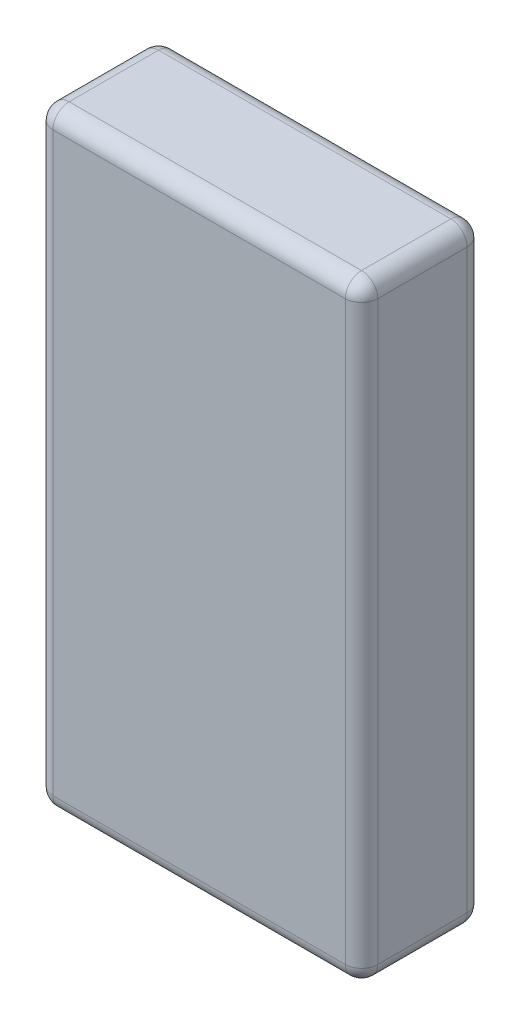
ISO-10303-21;
HEADER;
FILE_DESCRIPTION(('STEP AP214'),'2;1');
FILE_NAME('part.step','',(''),(''),'','','');
FILE_SCHEMA(('AUTOMOTIVE_DESIGN { 1 0 10303 214 1 1 1 1 }'));
ENDSEC;
DATA;
#1=APPLICATION_CONTEXT('core data for automotive mechanical design processes');
#2=APPLICATION_PROTOCOL_DEFINITION('international standard','automotive_design',2000,#1);
#3=PRODUCT_CONTEXT('',#1,'mechanical');
#4=PRODUCT('Part','Part','',(#3));
#5=PRODUCT_RELATED_PRODUCT_CATEGORY('part','',(#4));
#6=PRODUCT_DEFINITION_FORMATION('','',#4);
#7=PRODUCT_DEFINITION_CONTEXT('part definition',#1,'design');
#8=PRODUCT_DEFINITION('design','',#6,#7);
#9=PRODUCT_DEFINITION_SHAPE('','',#8);
#10=(LENGTH_UNIT() NAMED_UNIT(*) SI_UNIT(.MILLI.,.METRE.));
#11=(NAMED_UNIT(*) PLANE_ANGLE_UNIT() SI_UNIT($,.RADIAN.));
#12=(NAMED_UNIT(*) SI_UNIT($,.STERADIAN.) SOLID_ANGLE_UNIT());
#13=UNCERTAINTY_MEASURE_WITH_UNIT(LENGTH_MEASURE(1.E-05),#10,'distance_accuracy_value','');
#14=(GEOMETRIC_REPRESENTATION_CONTEXT(3) GLOBAL_UNCERTAINTY_ASSIGNED_CONTEXT((#13)) GLOBAL_UNIT_ASSIGNED_CONTEXT((#10,
#11,#12)) REPRESENTATION_CONTEXT('',''));
#15=CARTESIAN_POINT('',(0.,0.,0.));
#16=DIRECTION('',(0.,0.,1.));
#17=DIRECTION('',(1.,0.,0.));
#18=AXIS2_PLACEMENT_3D('',#15,#16,#17);
#19=CARTESIAN_POINT('',(20.,75.,-7.5));
#20=DIRECTION('',(-1.,0.,0.));
#21=DIRECTION('',(0.,0.,1.));
#22=AXIS2_PLACEMENT_3D('',#19,#20,#21);
#23=PLANE('',#22);
#24=DIRECTION('',(0.,0.,-1.));
#25=VECTOR('',#24,1.);
#26=CARTESIAN_POINT('',(20.,73.,7.5));
#27=LINE('',#26,#25);
#28=CARTESIAN_POINT('',(20.,73.,-5.5));
#29=VERTEX_POINT('',#28);
#30=CARTESIAN_POINT('',(20.,73.,5.5));
#31=VERTEX_POINT('',#30);
#32=EDGE_CURVE('E159',#29,#31,#27,.F.);
#33=ORIENTED_EDGE('',*,*,#32,.T.);
#34=DIRECTION('',(0.,-1.,0.));
#35=VECTOR('',#34,1.);
#36=CARTESIAN_POINT('',(20.,75.,5.5));
#37=LINE('',#36,#35);
#38=CARTESIAN_POINT('',(20.,2.,5.5));
#39=VERTEX_POINT('',#38);
#40=EDGE_CURVE('E132',#31,#39,#37,.T.);
#41=ORIENTED_EDGE('',*,*,#40,.T.);
#42=DIRECTION('',(0.,0.,-1.));
#43=VECTOR('',#42,1.);
#44=CARTESIAN_POINT('',(20.,2.,-7.5));
#45=LINE('',#44,#43);
#46=CARTESIAN_POINT('',(20.,2.,-5.5));
#47=VERTEX_POINT('',#46);
#48=EDGE_CURVE('E150',#39,#47,#45,.T.);
#49=ORIENTED_EDGE('',*,*,#48,.T.);
#50=DIRECTION('',(0.,-1.,0.));
#51=VECTOR('',#50,1.);
#52=CARTESIAN_POINT('',(20.,75.,-5.5));
#53=LINE('',#52,#51);
#54=EDGE_CURVE('E156',#47,#29,#53,.F.);
#55=ORIENTED_EDGE('',*,*,#54,.T.);
#56=EDGE_LOOP('',(#33,#41,#49,#55));
#57=FACE_BOUND('',#56,.T.);
#58=ADVANCED_FACE('F35',(#57),#23,.F.);
#59=CARTESIAN_POINT('',(-20.,75.,-7.5));
#60=DIRECTION('',(0.,0.,1.));
#61=DIRECTION('',(1.,0.,0.));
#62=AXIS2_PLACEMENT_3D('',#59,#60,#61);
#63=PLANE('',#62);
#64=DIRECTION('',(0.,-1.,0.));
#65=VECTOR('',#64,1.);
#66=CARTESIAN_POINT('',(-18.,75.,-7.5));
#67=LINE('',#66,#65);
#68=CARTESIAN_POINT('',(-18.,2.,-7.5));
#69=VERTEX_POINT('',#68);
#70=CARTESIAN_POINT('',(-18.,73.,-7.5));
#71=VERTEX_POINT('',#70);
#72=EDGE_CURVE('E185',#69,#71,#67,.F.);
#73=ORIENTED_EDGE('',*,*,#72,.T.);
#74=DIRECTION('',(-1.,0.,0.));
#75=VECTOR('',#74,1.);
#76=CARTESIAN_POINT('',(20.,73.,-7.5));
#77=LINE('',#76,#75);
#78=CARTESIAN_POINT('',(18.,73.,-7.5));
#79=VERTEX_POINT('',#78);
#80=EDGE_CURVE('E187',#71,#79,#77,.F.);
#81=ORIENTED_EDGE('',*,*,#80,.T.);
#82=DIRECTION('',(0.,-1.,0.));
#83=VECTOR('',#82,1.);
#84=CARTESIAN_POINT('',(18.,75.,-7.5));
#85=LINE('',#84,#83);
#86=CARTESIAN_POINT('',(18.,2.,-7.5));
#87=VERTEX_POINT('',#86);
#88=EDGE_CURVE('E181',#79,#87,#85,.T.);
#89=ORIENTED_EDGE('',*,*,#88,.T.);
#90=DIRECTION('',(-1.,0.,0.));
#91=VECTOR('',#90,1.);
#92=CARTESIAN_POINT('',(-20.,2.,-7.5));
#93=LINE('',#92,#91);
#94=EDGE_CURVE('E183',#87,#69,#93,.T.);
#95=ORIENTED_EDGE('',*,*,#94,.T.);
#96=EDGE_LOOP('',(#73,#81,#89,#95));
#97=FACE_BOUND('',#96,.T.);
#98=ADVANCED_FACE('F303',(#97),#63,.F.);
#99=CARTESIAN_POINT('',(-20.,75.,-7.5));
#100=DIRECTION('',(1.,0.,0.));
#101=DIRECTION('',(0.,0.,-1.));
#102=AXIS2_PLACEMENT_3D('',#99,#100,#101);
#103=PLANE('',#102);
#104=DIRECTION('',(0.,-1.,0.));
#105=VECTOR('',#104,1.);
#106=CARTESIAN_POINT('',(-20.,75.,5.5));
#107=LINE('',#106,#105);
#108=CARTESIAN_POINT('',(-20.,2.,5.5));
#109=VERTEX_POINT('',#108);
#110=CARTESIAN_POINT('',(-20.,73.,5.5));
#111=VERTEX_POINT('',#110);
#112=EDGE_CURVE('E194',#109,#111,#107,.F.);
#113=ORIENTED_EDGE('',*,*,#112,.T.);
#114=DIRECTION('',(0.,0.,1.));
#115=VECTOR('',#114,1.);
#116=CARTESIAN_POINT('',(-20.,73.,-7.5));
#117=LINE('',#116,#115);
#118=CARTESIAN_POINT('',(-20.,73.,-5.5));
#119=VERTEX_POINT('',#118);
#120=EDGE_CURVE('E196',#111,#119,#117,.F.);
#121=ORIENTED_EDGE('',*,*,#120,.T.);
#122=DIRECTION('',(0.,-1.,0.));
#123=VECTOR('',#122,1.);
#124=CARTESIAN_POINT('',(-20.,75.,-5.5));
#125=LINE('',#124,#123);
#126=CARTESIAN_POINT('',(-20.,2.,-5.5));
#127=VERTEX_POINT('',#126);
#128=EDGE_CURVE('E190',#119,#127,#125,.T.);
#129=ORIENTED_EDGE('',*,*,#128,.T.);
#130=DIRECTION('',(0.,0.,1.));
#131=VECTOR('',#130,1.);
#132=CARTESIAN_POINT('',(-20.,2.,-7.5));
#133=LINE('',#132,#131);
#134=EDGE_CURVE('E192',#127,#109,#133,.T.);
#135=ORIENTED_EDGE('',*,*,#134,.T.);
#136=EDGE_LOOP('',(#113,#121,#129,#135));
#137=FACE_BOUND('',#136,.T.);
#138=ADVANCED_FACE('F268',(#137),#103,.F.);
#139=CARTESIAN_POINT('',(-20.,75.,7.5));
#140=DIRECTION('',(0.,0.,-1.));
#141=DIRECTION('',(-1.,0.,0.));
#142=AXIS2_PLACEMENT_3D('',#139,#140,#141);
#143=PLANE('',#142);
#144=DIRECTION('',(1.,0.,0.));
#145=VECTOR('',#144,1.);
#146=CARTESIAN_POINT('',(-20.,2.,7.5));
#147=LINE('',#146,#145);
#148=CARTESIAN_POINT('',(-18.,2.,7.5));
#149=VERTEX_POINT('',#148);
#150=CARTESIAN_POINT('',(18.,2.,7.5));
#151=VERTEX_POINT('',#150);
#152=EDGE_CURVE('E163',#149,#151,#147,.T.);
#153=ORIENTED_EDGE('',*,*,#152,.T.);
#154=DIRECTION('',(0.,-1.,0.));
#155=VECTOR('',#154,1.);
#156=CARTESIAN_POINT('',(18.,75.,7.5));
#157=LINE('',#156,#155);
#158=CARTESIAN_POINT('',(18.,73.,7.5));
#159=VERTEX_POINT('',#158);
#160=EDGE_CURVE('E134',#151,#159,#157,.F.);
#161=ORIENTED_EDGE('',*,*,#160,.T.);
#162=DIRECTION('',(1.,0.,0.));
#163=VECTOR('',#162,1.);
#164=CARTESIAN_POINT('',(-20.,73.,7.5));
#165=LINE('',#164,#163);
#166=CARTESIAN_POINT('',(-18.,73.,7.5));
#167=VERTEX_POINT('',#166);
#168=EDGE_CURVE('E169',#159,#167,#165,.F.);
#169=ORIENTED_EDGE('',*,*,#168,.T.);
#170=DIRECTION('',(0.,-1.,0.));
#171=VECTOR('',#170,1.);
#172=CARTESIAN_POINT('',(-18.,75.,7.5));
#173=LINE('',#172,#171);
#174=EDGE_CURVE('E161',#167,#149,#173,.T.);
#175=ORIENTED_EDGE('',*,*,#174,.T.);
#176=EDGE_LOOP('',(#153,#161,#169,#175));
#177=FACE_BOUND('',#176,.T.);
#178=ADVANCED_FACE('F317',(#177),#143,.F.);
#179=CARTESIAN_POINT('',(0.,75.,0.));
#180=DIRECTION('',(0.,1.,0.));
#181=DIRECTION('',(0.,0.,1.));
#182=AXIS2_PLACEMENT_3D('',#179,#180,#181);
#183=PLANE('',#182);
#184=DIRECTION('',(1.,0.,0.));
#185=VECTOR('',#184,1.);
#186=CARTESIAN_POINT('',(20.,75.,5.5));
#187=LINE('',#186,#185);
#188=CARTESIAN_POINT('',(-18.,75.,5.5));
#189=VERTEX_POINT('',#188);
#190=CARTESIAN_POINT('',(18.,75.,5.5));
#191=VERTEX_POINT('',#190);
#192=EDGE_CURVE('E172',#189,#191,#187,.T.);
#193=ORIENTED_EDGE('',*,*,#192,.T.);
#194=DIRECTION('',(0.,0.,-1.));
#195=VECTOR('',#194,1.);
#196=CARTESIAN_POINT('',(18.,75.,-7.5));
#197=LINE('',#196,#195);
#198=CARTESIAN_POINT('',(18.,75.,-5.5));
#199=VERTEX_POINT('',#198);
#200=EDGE_CURVE('E178',#191,#199,#197,.T.);
#201=ORIENTED_EDGE('',*,*,#200,.T.);
#202=DIRECTION('',(-1.,0.,0.));
#203=VECTOR('',#202,1.);
#204=CARTESIAN_POINT('',(-20.,75.,-5.5));
#205=LINE('',#204,#203);
#206=CARTESIAN_POINT('',(-18.,75.,-5.5));
#207=VERTEX_POINT('',#206);
#208=EDGE_CURVE('E176',#199,#207,#205,.T.);
#209=ORIENTED_EDGE('',*,*,#208,.T.);
#210=DIRECTION('',(0.,0.,1.));
#211=VECTOR('',#210,1.);
#212=CARTESIAN_POINT('',(-18.,75.,7.5));
#213=LINE('',#212,#211);
#214=EDGE_CURVE('E174',#207,#189,#213,.T.);
#215=ORIENTED_EDGE('',*,*,#214,.T.);
#216=EDGE_LOOP('',(#193,#201,#209,#215));
#217=FACE_BOUND('',#216,.T.);
#218=ADVANCED_FACE('F289',(#217),#183,.T.);
#219=CARTESIAN_POINT('',(0.,0.,0.));
#220=DIRECTION('',(0.,1.,0.));
#221=DIRECTION('',(0.,0.,1.));
#222=AXIS2_PLACEMENT_3D('',#219,#220,#221);
#223=PLANE('',#222);
#224=DIRECTION('',(0.,0.,-1.));
#225=VECTOR('',#224,1.);
#226=CARTESIAN_POINT('',(18.,0.,0.));
#227=LINE('',#226,#225);
#228=CARTESIAN_POINT('',(18.,0.,-5.5));
#229=VERTEX_POINT('',#228);
#230=CARTESIAN_POINT('',(18.,0.,5.5));
#231=VERTEX_POINT('',#230);
#232=EDGE_CURVE('E199',#229,#231,#227,.F.);
#233=ORIENTED_EDGE('',*,*,#232,.T.);
#234=DIRECTION('',(1.,0.,0.));
#235=VECTOR('',#234,1.);
#236=CARTESIAN_POINT('',(0.,0.,5.5));
#237=LINE('',#236,#235);
#238=CARTESIAN_POINT('',(-18.,0.,5.5));
#239=VERTEX_POINT('',#238);
#240=EDGE_CURVE('E11',#231,#239,#237,.F.);
#241=ORIENTED_EDGE('',*,*,#240,.T.);
#242=DIRECTION('',(0.,0.,1.));
#243=VECTOR('',#242,1.);
#244=CARTESIAN_POINT('',(-18.,0.,0.));
#245=LINE('',#244,#243);
#246=CARTESIAN_POINT('',(-18.,0.,-5.5));
#247=VERTEX_POINT('',#246);
#248=EDGE_CURVE('E44',#239,#247,#245,.F.);
#249=ORIENTED_EDGE('',*,*,#248,.T.);
#250=DIRECTION('',(-1.,0.,0.));
#251=VECTOR('',#250,1.);
#252=CARTESIAN_POINT('',(0.,0.,-5.5));
#253=LINE('',#252,#251);
#254=EDGE_CURVE('E201',#247,#229,#253,.F.);
#255=ORIENTED_EDGE('',*,*,#254,.T.);
#256=EDGE_LOOP('',(#233,#241,#249,#255));
#257=FACE_BOUND('',#256,.T.);
#258=ADVANCED_FACE('F314',(#257),#223,.F.);
#259=CARTESIAN_POINT('',(-18.,75.,-5.5));
#260=DIRECTION('',(0.,-1.,0.));
#261=DIRECTION('',(0.,0.,-1.));
#262=AXIS2_PLACEMENT_3D('',#259,#260,#261);
#263=CYLINDRICAL_SURFACE('',#262,2.);
#264=CARTESIAN_POINT('',(-18.,73.,-5.5));
#265=DIRECTION('',(0.,1.,0.));
#266=DIRECTION('',(0.,0.,1.));
#267=AXIS2_PLACEMENT_3D('',#264,#265,#266);
#268=CIRCLE('',#267,2.);
#269=EDGE_CURVE('E39',#71,#119,#268,.T.);
#270=ORIENTED_EDGE('',*,*,#269,.F.);
#271=ORIENTED_EDGE('',*,*,#72,.F.);
#272=CARTESIAN_POINT('',(-18.,2.,-5.5));
#273=DIRECTION('',(0.,-1.,0.));
#274=DIRECTION('',(0.,0.,-1.));
#275=AXIS2_PLACEMENT_3D('',#272,#273,#274);
#276=CIRCLE('',#275,2.);
#277=EDGE_CURVE('E249',#127,#69,#276,.T.);
#278=ORIENTED_EDGE('',*,*,#277,.F.);
#279=ORIENTED_EDGE('',*,*,#128,.F.);
#280=EDGE_LOOP('',(#270,#271,#278,#279));
#281=FACE_BOUND('',#280,.T.);
#282=ADVANCED_FACE('F37',(#281),#263,.T.);
#283=CARTESIAN_POINT('',(-18.,73.,-5.5));
#284=DIRECTION('',(0.,0.,1.));
#285=DIRECTION('',(1.,0.,0.));
#286=AXIS2_PLACEMENT_3D('',#283,#284,#285);
#287=SPHERICAL_SURFACE('',#286,2.);
#288=CARTESIAN_POINT('',(-18.,73.,-5.5));
#289=DIRECTION('',(-1.,0.,0.));
#290=DIRECTION('',(0.,0.,1.));
#291=AXIS2_PLACEMENT_3D('',#288,#289,#290);
#292=CIRCLE('',#291,2.);
#293=EDGE_CURVE('E245',#71,#207,#292,.F.);
#294=ORIENTED_EDGE('',*,*,#293,.F.);
#295=ORIENTED_EDGE('',*,*,#269,.T.);
#296=CARTESIAN_POINT('',(-18.,73.,-5.5));
#297=DIRECTION('',(0.,0.,-1.));
#298=DIRECTION('',(-1.,0.,0.));
#299=AXIS2_PLACEMENT_3D('',#296,#297,#298);
#300=CIRCLE('',#299,2.);
#301=EDGE_CURVE('E248',#207,#119,#300,.F.);
#302=ORIENTED_EDGE('',*,*,#301,.F.);
#303=EDGE_LOOP('',(#294,#295,#302));
#304=FACE_BOUND('',#303,.T.);
#305=ADVANCED_FACE('F261',(#304),#287,.T.);
#306=CARTESIAN_POINT('',(-18.,2.,-5.5));
#307=DIRECTION('',(0.,0.,1.));
#308=DIRECTION('',(1.,0.,0.));
#309=AXIS2_PLACEMENT_3D('',#306,#307,#308);
#310=SPHERICAL_SURFACE('',#309,2.);
#311=CARTESIAN_POINT('',(-18.,2.,-5.5));
#312=DIRECTION('',(0.,0.,-1.));
#313=DIRECTION('',(-1.,0.,0.));
#314=AXIS2_PLACEMENT_3D('',#311,#312,#313);
#315=CIRCLE('',#314,2.);
#316=EDGE_CURVE('E240',#127,#247,#315,.F.);
#317=ORIENTED_EDGE('',*,*,#316,.F.);
#318=ORIENTED_EDGE('',*,*,#277,.T.);
#319=CARTESIAN_POINT('',(-18.,2.,-5.5));
#320=DIRECTION('',(-1.,0.,0.));
#321=DIRECTION('',(0.,0.,1.));
#322=AXIS2_PLACEMENT_3D('',#319,#320,#321);
#323=CIRCLE('',#322,2.);
#324=EDGE_CURVE('E242',#247,#69,#323,.F.);
#325=ORIENTED_EDGE('',*,*,#324,.F.);
#326=EDGE_LOOP('',(#317,#318,#325));
#327=FACE_BOUND('',#326,.T.);
#328=ADVANCED_FACE('F323',(#327),#310,.T.);
#329=CARTESIAN_POINT('',(-18.,73.,0.));
#330=DIRECTION('',(0.,0.,-1.));
#331=DIRECTION('',(-1.,0.,0.));
#332=AXIS2_PLACEMENT_3D('',#329,#330,#331);
#333=CYLINDRICAL_SURFACE('',#332,2.);
#334=ORIENTED_EDGE('',*,*,#301,.T.);
#335=ORIENTED_EDGE('',*,*,#120,.F.);
#336=CARTESIAN_POINT('',(-18.,73.,5.5));
#337=DIRECTION('',(0.,0.,1.));
#338=DIRECTION('',(1.,0.,0.));
#339=AXIS2_PLACEMENT_3D('',#336,#337,#338);
#340=CIRCLE('',#339,2.);
#341=EDGE_CURVE('E234',#189,#111,#340,.T.);
#342=ORIENTED_EDGE('',*,*,#341,.F.);
#343=ORIENTED_EDGE('',*,*,#214,.F.);
#344=EDGE_LOOP('',(#334,#335,#342,#343));
#345=FACE_BOUND('',#344,.T.);
#346=ADVANCED_FACE('F273',(#345),#333,.T.);
#347=CARTESIAN_POINT('',(0.,73.,-5.5));
#348=DIRECTION('',(1.,0.,0.));
#349=DIRECTION('',(0.,0.,-1.));
#350=AXIS2_PLACEMENT_3D('',#347,#348,#349);
#351=CYLINDRICAL_SURFACE('',#350,2.);
#352=ORIENTED_EDGE('',*,*,#293,.T.);
#353=ORIENTED_EDGE('',*,*,#208,.F.);
#354=CARTESIAN_POINT('',(18.,73.,-5.5));
#355=DIRECTION('',(1.,0.,0.));
#356=DIRECTION('',(0.,1.,0.));
#357=AXIS2_PLACEMENT_3D('',#354,#355,#356);
#358=CIRCLE('',#357,2.);
#359=EDGE_CURVE('E231',#79,#199,#358,.T.);
#360=ORIENTED_EDGE('',*,*,#359,.F.);
#361=ORIENTED_EDGE('',*,*,#80,.F.);
#362=EDGE_LOOP('',(#352,#353,#360,#361));
#363=FACE_BOUND('',#362,.T.);
#364=ADVANCED_FACE('F301',(#363),#351,.T.);
#365=CARTESIAN_POINT('',(18.,75.,-5.5));
#366=DIRECTION('',(0.,-1.,0.));
#367=DIRECTION('',(0.,0.,-1.));
#368=AXIS2_PLACEMENT_3D('',#365,#366,#367);
#369=CYLINDRICAL_SURFACE('',#368,2.);
#370=CARTESIAN_POINT('',(18.,2.,-5.5));
#371=DIRECTION('',(0.,-1.,0.));
#372=DIRECTION('',(0.,0.,-1.));
#373=AXIS2_PLACEMENT_3D('',#370,#371,#372);
#374=CIRCLE('',#373,2.);
#375=EDGE_CURVE('E226',#87,#47,#374,.T.);
#376=ORIENTED_EDGE('',*,*,#375,.F.);
#377=ORIENTED_EDGE('',*,*,#88,.F.);
#378=CARTESIAN_POINT('',(18.,73.,-5.5));
#379=DIRECTION('',(0.,1.,0.));
#380=DIRECTION('',(0.,0.,1.));
#381=AXIS2_PLACEMENT_3D('',#378,#379,#380);
#382=CIRCLE('',#381,2.);
#383=EDGE_CURVE('E229',#29,#79,#382,.T.);
#384=ORIENTED_EDGE('',*,*,#383,.F.);
#385=ORIENTED_EDGE('',*,*,#54,.F.);
#386=EDGE_LOOP('',(#376,#377,#384,#385));
#387=FACE_BOUND('',#386,.T.);
#388=ADVANCED_FACE('F311',(#387),#369,.T.);
#389=CARTESIAN_POINT('',(-20.,2.,-5.5));
#390=DIRECTION('',(-1.,0.,0.));
#391=DIRECTION('',(0.,0.,1.));
#392=AXIS2_PLACEMENT_3D('',#389,#390,#391);
#393=CYLINDRICAL_SURFACE('',#392,2.);
#394=ORIENTED_EDGE('',*,*,#324,.T.);
#395=ORIENTED_EDGE('',*,*,#94,.F.);
#396=CARTESIAN_POINT('',(18.,2.,-5.5));
#397=DIRECTION('',(1.,0.,0.));
#398=DIRECTION('',(0.,0.,-1.));
#399=AXIS2_PLACEMENT_3D('',#396,#397,#398);
#400=CIRCLE('',#399,2.);
#401=EDGE_CURVE('E223',#229,#87,#400,.T.);
#402=ORIENTED_EDGE('',*,*,#401,.F.);
#403=ORIENTED_EDGE('',*,*,#254,.F.);
#404=EDGE_LOOP('',(#394,#395,#402,#403));
#405=FACE_BOUND('',#404,.T.);
#406=ADVANCED_FACE('F308',(#405),#393,.T.);
#407=CARTESIAN_POINT('',(-18.,2.,-7.5));
#408=DIRECTION('',(0.,0.,1.));
#409=DIRECTION('',(1.,0.,0.));
#410=AXIS2_PLACEMENT_3D('',#407,#408,#409);
#411=CYLINDRICAL_SURFACE('',#410,2.);
#412=ORIENTED_EDGE('',*,*,#316,.T.);
#413=ORIENTED_EDGE('',*,*,#248,.F.);
#414=CARTESIAN_POINT('',(-18.,2.,5.5));
#415=DIRECTION('',(0.,0.,1.));
#416=DIRECTION('',(1.,0.,0.));
#417=AXIS2_PLACEMENT_3D('',#414,#415,#416);
#418=CIRCLE('',#417,2.);
#419=EDGE_CURVE('E221',#109,#239,#418,.T.);
#420=ORIENTED_EDGE('',*,*,#419,.F.);
#421=ORIENTED_EDGE('',*,*,#134,.F.);
#422=EDGE_LOOP('',(#412,#413,#420,#421));
#423=FACE_BOUND('',#422,.T.);
#424=ADVANCED_FACE('F322',(#423),#411,.T.);
#425=CARTESIAN_POINT('',(-18.,75.,5.5));
#426=DIRECTION('',(0.,-1.,0.));
#427=DIRECTION('',(0.,0.,-1.));
#428=AXIS2_PLACEMENT_3D('',#425,#426,#427);
#429=CYLINDRICAL_SURFACE('',#428,2.);
#430=CARTESIAN_POINT('',(-18.,73.,5.5));
#431=DIRECTION('',(0.,1.,0.));
#432=DIRECTION('',(0.,0.,1.));
#433=AXIS2_PLACEMENT_3D('',#430,#431,#432);
#434=CIRCLE('',#433,2.);
#435=EDGE_CURVE('E237',#111,#167,#434,.T.);
#436=ORIENTED_EDGE('',*,*,#435,.F.);
#437=ORIENTED_EDGE('',*,*,#112,.F.);
#438=CARTESIAN_POINT('',(-18.,2.,5.5));
#439=DIRECTION('',(0.,-1.,0.));
#440=DIRECTION('',(0.,0.,-1.));
#441=AXIS2_PLACEMENT_3D('',#438,#439,#440);
#442=CIRCLE('',#441,2.);
#443=EDGE_CURVE('E218',#149,#109,#442,.T.);
#444=ORIENTED_EDGE('',*,*,#443,.F.);
#445=ORIENTED_EDGE('',*,*,#174,.F.);
#446=EDGE_LOOP('',(#436,#437,#444,#445));
#447=FACE_BOUND('',#446,.T.);
#448=ADVANCED_FACE('F277',(#447),#429,.T.);
#449=CARTESIAN_POINT('',(-18.,73.,5.5));
#450=DIRECTION('',(0.,0.,1.));
#451=DIRECTION('',(1.,0.,0.));
#452=AXIS2_PLACEMENT_3D('',#449,#450,#451);
#453=SPHERICAL_SURFACE('',#452,2.);
#454=ORIENTED_EDGE('',*,*,#341,.T.);
#455=ORIENTED_EDGE('',*,*,#435,.T.);
#456=CARTESIAN_POINT('',(-18.,73.,5.5));
#457=DIRECTION('',(-1.,0.,0.));
#458=DIRECTION('',(0.,0.,1.));
#459=AXIS2_PLACEMENT_3D('',#456,#457,#458);
#460=CIRCLE('',#459,2.);
#461=EDGE_CURVE('E215',#189,#167,#460,.F.);
#462=ORIENTED_EDGE('',*,*,#461,.F.);
#463=EDGE_LOOP('',(#454,#455,#462));
#464=FACE_BOUND('',#463,.T.);
#465=ADVANCED_FACE('F281',(#464),#453,.T.);
#466=CARTESIAN_POINT('',(18.,73.,-5.5));
#467=DIRECTION('',(0.,0.,1.));
#468=DIRECTION('',(1.,0.,0.));
#469=AXIS2_PLACEMENT_3D('',#466,#467,#468);
#470=SPHERICAL_SURFACE('',#469,2.);
#471=ORIENTED_EDGE('',*,*,#383,.T.);
#472=ORIENTED_EDGE('',*,*,#359,.T.);
#473=CARTESIAN_POINT('',(18.,73.,-5.5));
#474=DIRECTION('',(0.,0.,-1.));
#475=DIRECTION('',(-1.,0.,0.));
#476=AXIS2_PLACEMENT_3D('',#473,#474,#475);
#477=CIRCLE('',#476,2.);
#478=EDGE_CURVE('E213',#29,#199,#477,.F.);
#479=ORIENTED_EDGE('',*,*,#478,.F.);
#480=EDGE_LOOP('',(#471,#472,#479));
#481=FACE_BOUND('',#480,.T.);
#482=ADVANCED_FACE('F297',(#481),#470,.T.);
#483=CARTESIAN_POINT('',(18.,2.,-5.5));
#484=DIRECTION('',(0.,0.,1.));
#485=DIRECTION('',(1.,0.,0.));
#486=AXIS2_PLACEMENT_3D('',#483,#484,#485);
#487=SPHERICAL_SURFACE('',#486,2.);
#488=ORIENTED_EDGE('',*,*,#401,.T.);
#489=ORIENTED_EDGE('',*,*,#375,.T.);
#490=CARTESIAN_POINT('',(18.,2.,-5.5));
#491=DIRECTION('',(0.,0.,-1.));
#492=DIRECTION('',(-1.,0.,0.));
#493=AXIS2_PLACEMENT_3D('',#490,#491,#492);
#494=CIRCLE('',#493,2.);
#495=EDGE_CURVE('E153',#229,#47,#494,.F.);
#496=ORIENTED_EDGE('',*,*,#495,.F.);
#497=EDGE_LOOP('',(#488,#489,#496));
#498=FACE_BOUND('',#497,.T.);
#499=ADVANCED_FACE('F313',(#498),#487,.T.);
#500=CARTESIAN_POINT('',(-18.,2.,5.5));
#501=DIRECTION('',(0.,0.,1.));
#502=DIRECTION('',(1.,0.,0.));
#503=AXIS2_PLACEMENT_3D('',#500,#501,#502);
#504=SPHERICAL_SURFACE('',#503,2.);
#505=ORIENTED_EDGE('',*,*,#443,.T.);
#506=ORIENTED_EDGE('',*,*,#419,.T.);
#507=CARTESIAN_POINT('',(-18.,2.,5.5));
#508=DIRECTION('',(-1.,0.,0.));
#509=DIRECTION('',(0.,0.,1.));
#510=AXIS2_PLACEMENT_3D('',#507,#508,#509);
#511=CIRCLE('',#510,2.);
#512=EDGE_CURVE('E52',#149,#239,#511,.F.);
#513=ORIENTED_EDGE('',*,*,#512,.F.);
#514=EDGE_LOOP('',(#505,#506,#513));
#515=FACE_BOUND('',#514,.T.);
#516=ADVANCED_FACE('F319',(#515),#504,.T.);
#517=CARTESIAN_POINT('',(0.,73.,5.5));
#518=DIRECTION('',(-1.,0.,0.));
#519=DIRECTION('',(0.,0.,1.));
#520=AXIS2_PLACEMENT_3D('',#517,#518,#519);
#521=CYLINDRICAL_SURFACE('',#520,2.);
#522=ORIENTED_EDGE('',*,*,#461,.T.);
#523=ORIENTED_EDGE('',*,*,#168,.F.);
#524=CARTESIAN_POINT('',(18.,73.,5.5));
#525=DIRECTION('',(1.,0.,0.));
#526=DIRECTION('',(0.,0.,-1.));
#527=AXIS2_PLACEMENT_3D('',#524,#525,#526);
#528=CIRCLE('',#527,2.);
#529=EDGE_CURVE('E208',#191,#159,#528,.T.);
#530=ORIENTED_EDGE('',*,*,#529,.F.);
#531=ORIENTED_EDGE('',*,*,#192,.F.);
#532=EDGE_LOOP('',(#522,#523,#530,#531));
#533=FACE_BOUND('',#532,.T.);
#534=ADVANCED_FACE('F286',(#533),#521,.T.);
#535=CARTESIAN_POINT('',(18.,73.,0.));
#536=DIRECTION('',(0.,0.,1.));
#537=DIRECTION('',(1.,0.,0.));
#538=AXIS2_PLACEMENT_3D('',#535,#536,#537);
#539=CYLINDRICAL_SURFACE('',#538,2.);
#540=ORIENTED_EDGE('',*,*,#478,.T.);
#541=ORIENTED_EDGE('',*,*,#200,.F.);
#542=CARTESIAN_POINT('',(18.,73.,5.5));
#543=DIRECTION('',(0.,0.,1.));
#544=DIRECTION('',(1.,0.,0.));
#545=AXIS2_PLACEMENT_3D('',#542,#543,#544);
#546=CIRCLE('',#545,2.);
#547=EDGE_CURVE('E147',#31,#191,#546,.T.);
#548=ORIENTED_EDGE('',*,*,#547,.F.);
#549=ORIENTED_EDGE('',*,*,#32,.F.);
#550=EDGE_LOOP('',(#540,#541,#548,#549));
#551=FACE_BOUND('',#550,.T.);
#552=ADVANCED_FACE('F291',(#551),#539,.T.);
#553=CARTESIAN_POINT('',(18.,2.,-7.5));
#554=DIRECTION('',(0.,0.,-1.));
#555=DIRECTION('',(-1.,0.,0.));
#556=AXIS2_PLACEMENT_3D('',#553,#554,#555);
#557=CYLINDRICAL_SURFACE('',#556,2.);
#558=ORIENTED_EDGE('',*,*,#495,.T.);
#559=ORIENTED_EDGE('',*,*,#48,.F.);
#560=CARTESIAN_POINT('',(18.,2.,5.5));
#561=DIRECTION('',(0.,0.,1.));
#562=DIRECTION('',(1.,0.,0.));
#563=AXIS2_PLACEMENT_3D('',#560,#561,#562);
#564=CIRCLE('',#563,2.);
#565=EDGE_CURVE('E140',#231,#39,#564,.T.);
#566=ORIENTED_EDGE('',*,*,#565,.F.);
#567=ORIENTED_EDGE('',*,*,#232,.F.);
#568=EDGE_LOOP('',(#558,#559,#566,#567));
#569=FACE_BOUND('',#568,.T.);
#570=ADVANCED_FACE('F151',(#569),#557,.T.);
#571=CARTESIAN_POINT('',(-20.,2.,5.5));
#572=DIRECTION('',(1.,0.,0.));
#573=DIRECTION('',(0.,0.,-1.));
#574=AXIS2_PLACEMENT_3D('',#571,#572,#573);
#575=CYLINDRICAL_SURFACE('',#574,2.);
#576=ORIENTED_EDGE('',*,*,#512,.T.);
#577=ORIENTED_EDGE('',*,*,#240,.F.);
#578=CARTESIAN_POINT('',(18.,2.,5.5));
#579=DIRECTION('',(1.,0.,0.));
#580=DIRECTION('',(0.,0.,-1.));
#581=AXIS2_PLACEMENT_3D('',#578,#579,#580);
#582=CIRCLE('',#581,2.);
#583=EDGE_CURVE('E144',#151,#231,#582,.T.);
#584=ORIENTED_EDGE('',*,*,#583,.F.);
#585=ORIENTED_EDGE('',*,*,#152,.F.);
#586=EDGE_LOOP('',(#576,#577,#584,#585));
#587=FACE_BOUND('',#586,.T.);
#588=ADVANCED_FACE('F315',(#587),#575,.T.);
#589=CARTESIAN_POINT('',(18.,73.,5.5));
#590=DIRECTION('',(0.,0.,1.));
#591=DIRECTION('',(1.,0.,0.));
#592=AXIS2_PLACEMENT_3D('',#589,#590,#591);
#593=SPHERICAL_SURFACE('',#592,2.);
#594=ORIENTED_EDGE('',*,*,#547,.T.);
#595=ORIENTED_EDGE('',*,*,#529,.T.);
#596=CARTESIAN_POINT('',(18.,73.,5.5));
#597=DIRECTION('',(0.,1.,0.));
#598=DIRECTION('',(0.,0.,1.));
#599=AXIS2_PLACEMENT_3D('',#596,#597,#598);
#600=CIRCLE('',#599,2.);
#601=EDGE_CURVE('E137',#31,#159,#600,.F.);
#602=ORIENTED_EDGE('',*,*,#601,.F.);
#603=EDGE_LOOP('',(#594,#595,#602));
#604=FACE_BOUND('',#603,.T.);
#605=ADVANCED_FACE('F343',(#604),#593,.T.);
#606=CARTESIAN_POINT('',(18.,2.,5.5));
#607=DIRECTION('',(0.,0.,1.));
#608=DIRECTION('',(1.,0.,0.));
#609=AXIS2_PLACEMENT_3D('',#606,#607,#608);
#610=SPHERICAL_SURFACE('',#609,2.);
#611=ORIENTED_EDGE('',*,*,#583,.T.);
#612=ORIENTED_EDGE('',*,*,#565,.T.);
#613=CARTESIAN_POINT('',(18.,2.,5.5));
#614=DIRECTION('',(0.,-1.,0.));
#615=DIRECTION('',(0.,0.,-1.));
#616=AXIS2_PLACEMENT_3D('',#613,#614,#615);
#617=CIRCLE('',#616,2.);
#618=EDGE_CURVE('E128',#151,#39,#617,.F.);
#619=ORIENTED_EDGE('',*,*,#618,.F.);
#620=EDGE_LOOP('',(#611,#612,#619));
#621=FACE_BOUND('',#620,.T.);
#622=ADVANCED_FACE('F142',(#621),#610,.T.);
#623=CARTESIAN_POINT('',(18.,75.,5.5));
#624=DIRECTION('',(0.,-1.,0.));
#625=DIRECTION('',(0.,0.,-1.));
#626=AXIS2_PLACEMENT_3D('',#623,#624,#625);
#627=CYLINDRICAL_SURFACE('',#626,2.);
#628=ORIENTED_EDGE('',*,*,#601,.T.);
#629=ORIENTED_EDGE('',*,*,#160,.F.);
#630=ORIENTED_EDGE('',*,*,#618,.T.);
#631=ORIENTED_EDGE('',*,*,#40,.F.);
#632=EDGE_LOOP('',(#628,#629,#630,#631));
#633=FACE_BOUND('',#632,.T.);
#634=ADVANCED_FACE('F130',(#633),#627,.T.);
#635=CLOSED_SHELL('',(#58,#98,#138,#178,#218,#258,#282,#305,#328,#346,#364,#388,#406,#424,#448,
#465,#482,#499,#516,#534,#552,#570,#588,#605,#622,#634));
#636=MANIFOLD_SOLID_BREP('B2',#635);
#637=ADVANCED_BREP_SHAPE_REPRESENTATION('',(#18,#636),#14);
#638=SHAPE_DEFINITION_REPRESENTATION(#9,#637);
ENDSEC;
END-ISO-10303-21;
